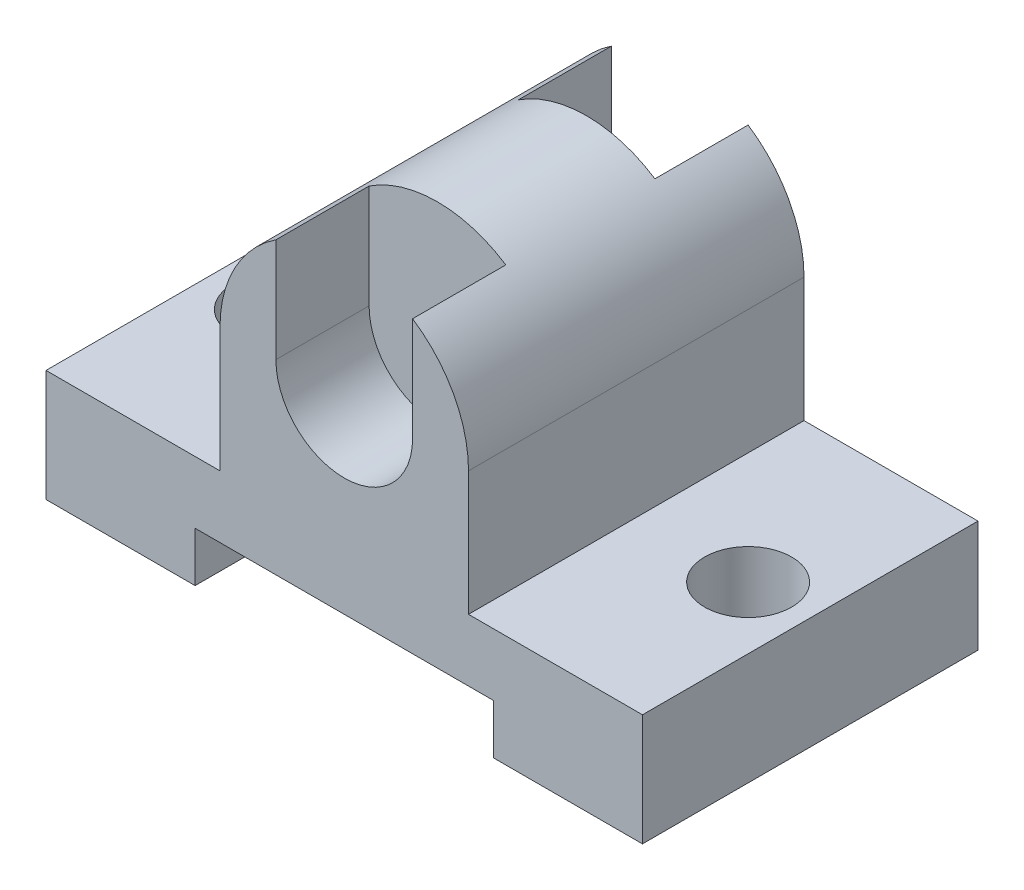
ISO-10303-21;
HEADER;
FILE_DESCRIPTION(('STEP AP214'),'2;1');
FILE_NAME('part.step','',(''),(''),'','','');
FILE_SCHEMA(('AUTOMOTIVE_DESIGN { 1 0 10303 214 1 1 1 1 }'));
ENDSEC;
DATA;
#1=APPLICATION_CONTEXT('core data for automotive mechanical design processes');
#2=APPLICATION_PROTOCOL_DEFINITION('international standard','automotive_design',2000,#1);
#3=PRODUCT_CONTEXT('',#1,'mechanical');
#4=PRODUCT('Part','Part','',(#3));
#5=PRODUCT_RELATED_PRODUCT_CATEGORY('part','',(#4));
#6=PRODUCT_DEFINITION_FORMATION('','',#4);
#7=PRODUCT_DEFINITION_CONTEXT('part definition',#1,'design');
#8=PRODUCT_DEFINITION('design','',#6,#7);
#9=PRODUCT_DEFINITION_SHAPE('','',#8);
#10=(LENGTH_UNIT() NAMED_UNIT(*) SI_UNIT(.MILLI.,.METRE.));
#11=(NAMED_UNIT(*) PLANE_ANGLE_UNIT() SI_UNIT($,.RADIAN.));
#12=(NAMED_UNIT(*) SI_UNIT($,.STERADIAN.) SOLID_ANGLE_UNIT());
#13=UNCERTAINTY_MEASURE_WITH_UNIT(LENGTH_MEASURE(1.E-05),#10,'distance_accuracy_value','');
#14=(GEOMETRIC_REPRESENTATION_CONTEXT(3) GLOBAL_UNCERTAINTY_ASSIGNED_CONTEXT((#13)) GLOBAL_UNIT_ASSIGNED_CONTEXT((#10,
#11,#12)) REPRESENTATION_CONTEXT('',''));
#15=CARTESIAN_POINT('',(0.,0.,0.));
#16=DIRECTION('',(0.,0.,1.));
#17=DIRECTION('',(1.,0.,0.));
#18=AXIS2_PLACEMENT_3D('',#15,#16,#17);
#19=CARTESIAN_POINT('',(-48.791461112919,0.,-54.));
#20=DIRECTION('',(-1.,0.,0.));
#21=DIRECTION('',(0.,0.,1.));
#22=AXIS2_PLACEMENT_3D('',#19,#20,#21);
#23=PLANE('',#22);
#24=DIRECTION('',(0.,-1.,0.));
#25=VECTOR('',#24,1.);
#26=CARTESIAN_POINT('',(-48.791461112919,0.,0.));
#27=LINE('',#26,#25);
#28=CARTESIAN_POINT('',(-48.791461112919,18.,0.));
#29=VERTEX_POINT('',#28);
#30=CARTESIAN_POINT('',(-48.791461112919,0.,0.));
#31=VERTEX_POINT('',#30);
#32=EDGE_CURVE('E275',#29,#31,#27,.T.);
#33=ORIENTED_EDGE('',*,*,#32,.F.);
#34=DIRECTION('',(0.,0.,1.));
#35=VECTOR('',#34,1.);
#36=CARTESIAN_POINT('',(-48.791461112919,18.,-54.));
#37=LINE('',#36,#35);
#38=CARTESIAN_POINT('',(-48.791461112919,18.,-54.));
#39=VERTEX_POINT('',#38);
#40=EDGE_CURVE('E312',#39,#29,#37,.T.);
#41=ORIENTED_EDGE('',*,*,#40,.F.);
#42=DIRECTION('',(0.,-1.,0.));
#43=VECTOR('',#42,1.);
#44=CARTESIAN_POINT('',(-48.791461112919,0.,-54.));
#45=LINE('',#44,#43);
#46=CARTESIAN_POINT('',(-48.791461112919,0.,-54.));
#47=VERTEX_POINT('',#46);
#48=EDGE_CURVE('E236',#39,#47,#45,.T.);
#49=ORIENTED_EDGE('',*,*,#48,.T.);
#50=DIRECTION('',(0.,0.,1.));
#51=VECTOR('',#50,1.);
#52=CARTESIAN_POINT('',(-48.791461112919,0.,-54.));
#53=LINE('',#52,#51);
#54=EDGE_CURVE('E274',#47,#31,#53,.T.);
#55=ORIENTED_EDGE('',*,*,#54,.T.);
#56=EDGE_LOOP('',(#33,#41,#49,#55));
#57=FACE_BOUND('',#56,.T.);
#58=ADVANCED_FACE('F37',(#57),#23,.T.);
#59=CARTESIAN_POINT('',(-48.791461112919,18.,-54.));
#60=DIRECTION('',(0.,1.,0.));
#61=DIRECTION('',(-1.,0.,0.));
#62=AXIS2_PLACEMENT_3D('',#59,#60,#61);
#63=PLANE('',#62);
#64=CARTESIAN_POINT('',(-38.791461112919,18.,-27.));
#65=DIRECTION('',(0.,1.,0.));
#66=DIRECTION('',(-1.,0.,0.));
#67=AXIS2_PLACEMENT_3D('',#64,#65,#66);
#68=CIRCLE('',#67,7.);
#69=CARTESIAN_POINT('',(-45.791461112919,18.,-27.));
#70=VERTEX_POINT('',#69);
#71=EDGE_CURVE('E223',#70,#70,#68,.T.);
#72=ORIENTED_EDGE('',*,*,#71,.F.);
#73=EDGE_LOOP('',(#72));
#74=FACE_BOUND('',#73,.T.);
#75=DIRECTION('',(-1.,0.,0.));
#76=VECTOR('',#75,1.);
#77=CARTESIAN_POINT('',(-48.791461112919,18.,0.));
#78=LINE('',#77,#76);
#79=CARTESIAN_POINT('',(-20.791461112919,18.,0.));
#80=VERTEX_POINT('',#79);
#81=EDGE_CURVE('E240',#80,#29,#78,.T.);
#82=ORIENTED_EDGE('',*,*,#81,.F.);
#83=DIRECTION('',(0.,0.,1.));
#84=VECTOR('',#83,1.);
#85=CARTESIAN_POINT('',(-20.791461112919,18.,-54.));
#86=LINE('',#85,#84);
#87=CARTESIAN_POINT('',(-20.791461112919,18.,-54.));
#88=VERTEX_POINT('',#87);
#89=EDGE_CURVE('E314',#88,#80,#86,.T.);
#90=ORIENTED_EDGE('',*,*,#89,.F.);
#91=DIRECTION('',(-1.,0.,0.));
#92=VECTOR('',#91,1.);
#93=CARTESIAN_POINT('',(-48.791461112919,18.,-54.));
#94=LINE('',#93,#92);
#95=EDGE_CURVE('E271',#88,#39,#94,.T.);
#96=ORIENTED_EDGE('',*,*,#95,.T.);
#97=ORIENTED_EDGE('',*,*,#40,.T.);
#98=EDGE_LOOP('',(#82,#90,#96,#97));
#99=FACE_BOUND('',#98,.T.);
#100=ADVANCED_FACE('F382',(#74,#99),#63,.T.);
#101=CARTESIAN_POINT('',(-20.791461112919,18.,-54.));
#102=DIRECTION('',(-1.,0.,0.));
#103=DIRECTION('',(0.,0.,1.));
#104=AXIS2_PLACEMENT_3D('',#101,#102,#103);
#105=PLANE('',#104);
#106=DIRECTION('',(0.,-1.,0.));
#107=VECTOR('',#106,1.);
#108=CARTESIAN_POINT('',(-20.791461112919,18.,0.));
#109=LINE('',#108,#107);
#110=CARTESIAN_POINT('',(-20.791461112919,38.,0.));
#111=VERTEX_POINT('',#110);
#112=EDGE_CURVE('E307',#111,#80,#109,.T.);
#113=ORIENTED_EDGE('',*,*,#112,.F.);
#114=DIRECTION('',(0.,0.,1.));
#115=VECTOR('',#114,1.);
#116=CARTESIAN_POINT('',(-20.791461112919,38.,-54.));
#117=LINE('',#116,#115);
#118=CARTESIAN_POINT('',(-20.791461112919,38.,-54.));
#119=VERTEX_POINT('',#118);
#120=EDGE_CURVE('E316',#119,#111,#117,.T.);
#121=ORIENTED_EDGE('',*,*,#120,.F.);
#122=DIRECTION('',(0.,-1.,0.));
#123=VECTOR('',#122,1.);
#124=CARTESIAN_POINT('',(-20.791461112919,18.,-54.));
#125=LINE('',#124,#123);
#126=EDGE_CURVE('E268',#119,#88,#125,.T.);
#127=ORIENTED_EDGE('',*,*,#126,.T.);
#128=ORIENTED_EDGE('',*,*,#89,.T.);
#129=EDGE_LOOP('',(#113,#121,#127,#128));
#130=FACE_BOUND('',#129,.T.);
#131=ADVANCED_FACE('F386',(#130),#105,.T.);
#132=CARTESIAN_POINT('',(-0.791461112918989,38.,-54.));
#133=DIRECTION('',(0.,0.,1.));
#134=DIRECTION('',(1.,0.,0.));
#135=AXIS2_PLACEMENT_3D('',#132,#133,#134);
#136=CYLINDRICAL_SURFACE('',#135,20.);
#137=DIRECTION('',(0.,0.,1.));
#138=VECTOR('',#137,1.);
#139=CARTESIAN_POINT('',(-11.791461112919,54.7032930884901,-54.));
#140=LINE('',#139,#138);
#141=CARTESIAN_POINT('',(-11.791461112919,54.7032930884901,-54.));
#142=VERTEX_POINT('',#141);
#143=CARTESIAN_POINT('',(-11.791461112919,54.7032930884901,-39.));
#144=VERTEX_POINT('',#143);
#145=EDGE_CURVE('E200',#142,#144,#140,.T.);
#146=ORIENTED_EDGE('',*,*,#145,.F.);
#147=CARTESIAN_POINT('',(-0.791461112918989,38.,-54.));
#148=DIRECTION('',(0.,0.,1.));
#149=DIRECTION('',(-1.,0.,0.));
#150=AXIS2_PLACEMENT_3D('',#147,#148,#149);
#151=CIRCLE('',#150,20.);
#152=EDGE_CURVE('E264',#142,#119,#151,.T.);
#153=ORIENTED_EDGE('',*,*,#152,.T.);
#154=ORIENTED_EDGE('',*,*,#120,.T.);
#155=CARTESIAN_POINT('',(-0.791461112918989,38.,0.));
#156=DIRECTION('',(0.,0.,1.));
#157=DIRECTION('',(-1.,0.,0.));
#158=AXIS2_PLACEMENT_3D('',#155,#156,#157);
#159=CIRCLE('',#158,20.);
#160=CARTESIAN_POINT('',(-11.791461112919,54.7032930884901,0.));
#161=VERTEX_POINT('',#160);
#162=EDGE_CURVE('E303',#161,#111,#159,.T.);
#163=ORIENTED_EDGE('',*,*,#162,.F.);
#164=DIRECTION('',(0.,0.,1.));
#165=VECTOR('',#164,1.);
#166=CARTESIAN_POINT('',(-11.791461112919,54.7032930884901,-15.));
#167=LINE('',#166,#165);
#168=CARTESIAN_POINT('',(-11.791461112919,54.7032930884901,-15.));
#169=VERTEX_POINT('',#168);
#170=EDGE_CURVE('E221',#169,#161,#167,.T.);
#171=ORIENTED_EDGE('',*,*,#170,.F.);
#172=CARTESIAN_POINT('',(-0.791461112918989,38.,-15.));
#173=DIRECTION('',(0.,0.,1.));
#174=DIRECTION('',(1.,0.,0.));
#175=AXIS2_PLACEMENT_3D('',#172,#173,#174);
#176=CIRCLE('',#175,20.);
#177=CARTESIAN_POINT('',(10.208538887081,54.7032930884901,-15.));
#178=VERTEX_POINT('',#177);
#179=EDGE_CURVE('E211',#178,#169,#176,.T.);
#180=ORIENTED_EDGE('',*,*,#179,.F.);
#181=DIRECTION('',(0.,0.,1.));
#182=VECTOR('',#181,1.);
#183=CARTESIAN_POINT('',(10.208538887081,54.7032930884901,-15.));
#184=LINE('',#183,#182);
#185=CARTESIAN_POINT('',(10.208538887081,54.7032930884901,0.));
#186=VERTEX_POINT('',#185);
#187=EDGE_CURVE('E224',#178,#186,#184,.T.);
#188=ORIENTED_EDGE('',*,*,#187,.T.);
#189=CARTESIAN_POINT('',(19.208538887081,38.,0.));
#190=VERTEX_POINT('',#189);
#191=EDGE_CURVE('E304',#190,#186,#159,.T.);
#192=ORIENTED_EDGE('',*,*,#191,.F.);
#193=DIRECTION('',(0.,0.,1.));
#194=VECTOR('',#193,1.);
#195=CARTESIAN_POINT('',(19.208538887081,38.,-54.));
#196=LINE('',#195,#194);
#197=CARTESIAN_POINT('',(19.208538887081,38.,-54.));
#198=VERTEX_POINT('',#197);
#199=EDGE_CURVE('E319',#198,#190,#196,.T.);
#200=ORIENTED_EDGE('',*,*,#199,.F.);
#201=CARTESIAN_POINT('',(10.208538887081,54.7032930884901,-54.));
#202=VERTEX_POINT('',#201);
#203=EDGE_CURVE('E265',#198,#202,#151,.T.);
#204=ORIENTED_EDGE('',*,*,#203,.T.);
#205=DIRECTION('',(0.,0.,1.));
#206=VECTOR('',#205,1.);
#207=CARTESIAN_POINT('',(10.208538887081,54.7032930884901,-54.));
#208=LINE('',#207,#206);
#209=CARTESIAN_POINT('',(10.208538887081,54.7032930884901,-39.));
#210=VERTEX_POINT('',#209);
#211=EDGE_CURVE('E51',#210,#202,#208,.F.);
#212=ORIENTED_EDGE('',*,*,#211,.F.);
#213=CARTESIAN_POINT('',(-0.791461112918989,38.,-39.));
#214=DIRECTION('',(0.,0.,-1.));
#215=DIRECTION('',(-1.,0.,0.));
#216=AXIS2_PLACEMENT_3D('',#213,#214,#215);
#217=CIRCLE('',#216,20.);
#218=EDGE_CURVE('E11',#210,#144,#217,.F.);
#219=ORIENTED_EDGE('',*,*,#218,.T.);
#220=EDGE_LOOP('',(#146,#153,#154,#163,#171,#180,#188,#192,#200,#204,#212,#219));
#221=FACE_BOUND('',#220,.T.);
#222=ADVANCED_FACE('F390',(#221),#136,.T.);
#223=CARTESIAN_POINT('',(19.208538887081,18.,-54.));
#224=DIRECTION('',(1.,0.,0.));
#225=DIRECTION('',(0.,0.,-1.));
#226=AXIS2_PLACEMENT_3D('',#223,#224,#225);
#227=PLANE('',#226);
#228=DIRECTION('',(0.,1.,0.));
#229=VECTOR('',#228,1.);
#230=CARTESIAN_POINT('',(19.208538887081,18.,0.));
#231=LINE('',#230,#229);
#232=CARTESIAN_POINT('',(19.208538887081,18.,0.));
#233=VERTEX_POINT('',#232);
#234=EDGE_CURVE('E300',#233,#190,#231,.T.);
#235=ORIENTED_EDGE('',*,*,#234,.F.);
#236=DIRECTION('',(0.,0.,1.));
#237=VECTOR('',#236,1.);
#238=CARTESIAN_POINT('',(19.208538887081,18.,-54.));
#239=LINE('',#238,#237);
#240=CARTESIAN_POINT('',(19.208538887081,18.,-54.));
#241=VERTEX_POINT('',#240);
#242=EDGE_CURVE('E321',#241,#233,#239,.T.);
#243=ORIENTED_EDGE('',*,*,#242,.F.);
#244=DIRECTION('',(0.,1.,0.));
#245=VECTOR('',#244,1.);
#246=CARTESIAN_POINT('',(19.208538887081,18.,-54.));
#247=LINE('',#246,#245);
#248=EDGE_CURVE('E261',#241,#198,#247,.T.);
#249=ORIENTED_EDGE('',*,*,#248,.T.);
#250=ORIENTED_EDGE('',*,*,#199,.T.);
#251=EDGE_LOOP('',(#235,#243,#249,#250));
#252=FACE_BOUND('',#251,.T.);
#253=ADVANCED_FACE('F399',(#252),#227,.T.);
#254=CARTESIAN_POINT('',(47.208538887081,18.,-54.));
#255=DIRECTION('',(0.,1.,0.));
#256=DIRECTION('',(-1.,0.,0.));
#257=AXIS2_PLACEMENT_3D('',#254,#255,#256);
#258=PLANE('',#257);
#259=CARTESIAN_POINT('',(37.208538887081,18.,-27.));
#260=DIRECTION('',(0.,1.,0.));
#261=DIRECTION('',(-1.,0.,0.));
#262=AXIS2_PLACEMENT_3D('',#259,#260,#261);
#263=CIRCLE('',#262,7.);
#264=CARTESIAN_POINT('',(30.208538887081,18.,-27.));
#265=VERTEX_POINT('',#264);
#266=EDGE_CURVE('E230',#265,#265,#263,.T.);
#267=ORIENTED_EDGE('',*,*,#266,.F.);
#268=EDGE_LOOP('',(#267));
#269=FACE_BOUND('',#268,.T.);
#270=DIRECTION('',(-1.,0.,0.));
#271=VECTOR('',#270,1.);
#272=CARTESIAN_POINT('',(47.208538887081,18.,0.));
#273=LINE('',#272,#271);
#274=CARTESIAN_POINT('',(47.208538887081,18.,0.));
#275=VERTEX_POINT('',#274);
#276=EDGE_CURVE('E297',#275,#233,#273,.T.);
#277=ORIENTED_EDGE('',*,*,#276,.F.);
#278=DIRECTION('',(0.,0.,1.));
#279=VECTOR('',#278,1.);
#280=CARTESIAN_POINT('',(47.208538887081,18.,-54.));
#281=LINE('',#280,#279);
#282=CARTESIAN_POINT('',(47.208538887081,18.,-54.));
#283=VERTEX_POINT('',#282);
#284=EDGE_CURVE('E323',#283,#275,#281,.T.);
#285=ORIENTED_EDGE('',*,*,#284,.F.);
#286=DIRECTION('',(-1.,0.,0.));
#287=VECTOR('',#286,1.);
#288=CARTESIAN_POINT('',(47.208538887081,18.,-54.));
#289=LINE('',#288,#287);
#290=EDGE_CURVE('E258',#283,#241,#289,.T.);
#291=ORIENTED_EDGE('',*,*,#290,.T.);
#292=ORIENTED_EDGE('',*,*,#242,.T.);
#293=EDGE_LOOP('',(#277,#285,#291,#292));
#294=FACE_BOUND('',#293,.T.);
#295=ADVANCED_FACE('F403',(#269,#294),#258,.T.);
#296=CARTESIAN_POINT('',(47.208538887081,0.,-54.));
#297=DIRECTION('',(1.,0.,0.));
#298=DIRECTION('',(0.,0.,-1.));
#299=AXIS2_PLACEMENT_3D('',#296,#297,#298);
#300=PLANE('',#299);
#301=DIRECTION('',(0.,1.,0.));
#302=VECTOR('',#301,1.);
#303=CARTESIAN_POINT('',(47.208538887081,0.,0.));
#304=LINE('',#303,#302);
#305=CARTESIAN_POINT('',(47.208538887081,0.,0.));
#306=VERTEX_POINT('',#305);
#307=EDGE_CURVE('E294',#306,#275,#304,.T.);
#308=ORIENTED_EDGE('',*,*,#307,.F.);
#309=DIRECTION('',(0.,0.,1.));
#310=VECTOR('',#309,1.);
#311=CARTESIAN_POINT('',(47.208538887081,0.,-54.));
#312=LINE('',#311,#310);
#313=CARTESIAN_POINT('',(47.208538887081,0.,-54.));
#314=VERTEX_POINT('',#313);
#315=EDGE_CURVE('E325',#314,#306,#312,.T.);
#316=ORIENTED_EDGE('',*,*,#315,.F.);
#317=DIRECTION('',(0.,1.,0.));
#318=VECTOR('',#317,1.);
#319=CARTESIAN_POINT('',(47.208538887081,0.,-54.));
#320=LINE('',#319,#318);
#321=EDGE_CURVE('E255',#314,#283,#320,.T.);
#322=ORIENTED_EDGE('',*,*,#321,.T.);
#323=ORIENTED_EDGE('',*,*,#284,.T.);
#324=EDGE_LOOP('',(#308,#316,#322,#323));
#325=FACE_BOUND('',#324,.T.);
#326=ADVANCED_FACE('F348',(#325),#300,.T.);
#327=CARTESIAN_POINT('',(23.208538887081,0.,-54.));
#328=DIRECTION('',(0.,-1.,0.));
#329=DIRECTION('',(0.,0.,-1.));
#330=AXIS2_PLACEMENT_3D('',#327,#328,#329);
#331=PLANE('',#330);
#332=CARTESIAN_POINT('',(37.208538887081,0.,-27.));
#333=DIRECTION('',(0.,-1.,0.));
#334=DIRECTION('',(0.,0.,-1.));
#335=AXIS2_PLACEMENT_3D('',#332,#333,#334);
#336=CIRCLE('',#335,7.);
#337=CARTESIAN_POINT('',(37.208538887081,0.,-34.));
#338=VERTEX_POINT('',#337);
#339=EDGE_CURVE('E279',#338,#338,#336,.T.);
#340=ORIENTED_EDGE('',*,*,#339,.F.);
#341=EDGE_LOOP('',(#340));
#342=FACE_BOUND('',#341,.T.);
#343=DIRECTION('',(1.,0.,0.));
#344=VECTOR('',#343,1.);
#345=CARTESIAN_POINT('',(23.208538887081,0.,0.));
#346=LINE('',#345,#344);
#347=CARTESIAN_POINT('',(23.208538887081,0.,0.));
#348=VERTEX_POINT('',#347);
#349=EDGE_CURVE('E291',#348,#306,#346,.T.);
#350=ORIENTED_EDGE('',*,*,#349,.F.);
#351=DIRECTION('',(0.,0.,1.));
#352=VECTOR('',#351,1.);
#353=CARTESIAN_POINT('',(23.208538887081,0.,-54.));
#354=LINE('',#353,#352);
#355=CARTESIAN_POINT('',(23.208538887081,0.,-54.));
#356=VERTEX_POINT('',#355);
#357=EDGE_CURVE('E327',#356,#348,#354,.T.);
#358=ORIENTED_EDGE('',*,*,#357,.F.);
#359=DIRECTION('',(1.,0.,0.));
#360=VECTOR('',#359,1.);
#361=CARTESIAN_POINT('',(23.208538887081,0.,-54.));
#362=LINE('',#361,#360);
#363=EDGE_CURVE('E252',#356,#314,#362,.T.);
#364=ORIENTED_EDGE('',*,*,#363,.T.);
#365=ORIENTED_EDGE('',*,*,#315,.T.);
#366=EDGE_LOOP('',(#350,#358,#364,#365));
#367=FACE_BOUND('',#366,.T.);
#368=ADVANCED_FACE('F344',(#342,#367),#331,.T.);
#369=CARTESIAN_POINT('',(23.208538887081,8.,-54.));
#370=DIRECTION('',(-1.,0.,0.));
#371=DIRECTION('',(0.,0.,1.));
#372=AXIS2_PLACEMENT_3D('',#369,#370,#371);
#373=PLANE('',#372);
#374=DIRECTION('',(0.,-1.,0.));
#375=VECTOR('',#374,1.);
#376=CARTESIAN_POINT('',(23.208538887081,8.,0.));
#377=LINE('',#376,#375);
#378=CARTESIAN_POINT('',(23.208538887081,8.,0.));
#379=VERTEX_POINT('',#378);
#380=EDGE_CURVE('E288',#379,#348,#377,.T.);
#381=ORIENTED_EDGE('',*,*,#380,.F.);
#382=DIRECTION('',(0.,0.,1.));
#383=VECTOR('',#382,1.);
#384=CARTESIAN_POINT('',(23.208538887081,8.,-54.));
#385=LINE('',#384,#383);
#386=CARTESIAN_POINT('',(23.208538887081,8.,-54.));
#387=VERTEX_POINT('',#386);
#388=EDGE_CURVE('E329',#387,#379,#385,.T.);
#389=ORIENTED_EDGE('',*,*,#388,.F.);
#390=DIRECTION('',(0.,-1.,0.));
#391=VECTOR('',#390,1.);
#392=CARTESIAN_POINT('',(23.208538887081,8.,-54.));
#393=LINE('',#392,#391);
#394=EDGE_CURVE('E249',#387,#356,#393,.T.);
#395=ORIENTED_EDGE('',*,*,#394,.T.);
#396=ORIENTED_EDGE('',*,*,#357,.T.);
#397=EDGE_LOOP('',(#381,#389,#395,#396));
#398=FACE_BOUND('',#397,.T.);
#399=ADVANCED_FACE('F347',(#398),#373,.T.);
#400=CARTESIAN_POINT('',(-24.791461112919,8.,-54.));
#401=DIRECTION('',(0.,-1.,0.));
#402=DIRECTION('',(0.,0.,-1.));
#403=AXIS2_PLACEMENT_3D('',#400,#401,#402);
#404=PLANE('',#403);
#405=DIRECTION('',(1.,0.,0.));
#406=VECTOR('',#405,1.);
#407=CARTESIAN_POINT('',(-24.791461112919,8.,0.));
#408=LINE('',#407,#406);
#409=CARTESIAN_POINT('',(-24.791461112919,8.,0.));
#410=VERTEX_POINT('',#409);
#411=EDGE_CURVE('E285',#410,#379,#408,.T.);
#412=ORIENTED_EDGE('',*,*,#411,.F.);
#413=DIRECTION('',(0.,0.,1.));
#414=VECTOR('',#413,1.);
#415=CARTESIAN_POINT('',(-24.791461112919,8.,-54.));
#416=LINE('',#415,#414);
#417=CARTESIAN_POINT('',(-24.791461112919,8.,-54.));
#418=VERTEX_POINT('',#417);
#419=EDGE_CURVE('E331',#418,#410,#416,.T.);
#420=ORIENTED_EDGE('',*,*,#419,.F.);
#421=DIRECTION('',(1.,0.,0.));
#422=VECTOR('',#421,1.);
#423=CARTESIAN_POINT('',(-24.791461112919,8.,-54.));
#424=LINE('',#423,#422);
#425=EDGE_CURVE('E246',#418,#387,#424,.T.);
#426=ORIENTED_EDGE('',*,*,#425,.T.);
#427=ORIENTED_EDGE('',*,*,#388,.T.);
#428=EDGE_LOOP('',(#412,#420,#426,#427));
#429=FACE_BOUND('',#428,.T.);
#430=ADVANCED_FACE('F367',(#429),#404,.T.);
#431=CARTESIAN_POINT('',(-24.791461112919,0.,-54.));
#432=DIRECTION('',(1.,0.,0.));
#433=DIRECTION('',(0.,0.,-1.));
#434=AXIS2_PLACEMENT_3D('',#431,#432,#433);
#435=PLANE('',#434);
#436=DIRECTION('',(0.,1.,0.));
#437=VECTOR('',#436,1.);
#438=CARTESIAN_POINT('',(-24.791461112919,0.,0.));
#439=LINE('',#438,#437);
#440=CARTESIAN_POINT('',(-24.791461112919,0.,0.));
#441=VERTEX_POINT('',#440);
#442=EDGE_CURVE('E282',#441,#410,#439,.T.);
#443=ORIENTED_EDGE('',*,*,#442,.F.);
#444=DIRECTION('',(0.,0.,1.));
#445=VECTOR('',#444,1.);
#446=CARTESIAN_POINT('',(-24.791461112919,0.,-54.));
#447=LINE('',#446,#445);
#448=CARTESIAN_POINT('',(-24.791461112919,0.,-54.));
#449=VERTEX_POINT('',#448);
#450=EDGE_CURVE('E333',#449,#441,#447,.T.);
#451=ORIENTED_EDGE('',*,*,#450,.F.);
#452=DIRECTION('',(0.,1.,0.));
#453=VECTOR('',#452,1.);
#454=CARTESIAN_POINT('',(-24.791461112919,0.,-54.));
#455=LINE('',#454,#453);
#456=EDGE_CURVE('E243',#449,#418,#455,.T.);
#457=ORIENTED_EDGE('',*,*,#456,.T.);
#458=ORIENTED_EDGE('',*,*,#419,.T.);
#459=EDGE_LOOP('',(#443,#451,#457,#458));
#460=FACE_BOUND('',#459,.T.);
#461=ADVANCED_FACE('F370',(#460),#435,.T.);
#462=CARTESIAN_POINT('',(-48.791461112919,0.,-54.));
#463=DIRECTION('',(0.,-1.,0.));
#464=DIRECTION('',(1.,0.,0.));
#465=AXIS2_PLACEMENT_3D('',#462,#463,#464);
#466=PLANE('',#465);
#467=CARTESIAN_POINT('',(-38.791461112919,0.,-27.));
#468=DIRECTION('',(0.,-1.,0.));
#469=DIRECTION('',(1.,0.,0.));
#470=AXIS2_PLACEMENT_3D('',#467,#468,#469);
#471=CIRCLE('',#470,7.);
#472=CARTESIAN_POINT('',(-31.791461112919,0.,-27.));
#473=VERTEX_POINT('',#472);
#474=EDGE_CURVE('E233',#473,#473,#471,.T.);
#475=ORIENTED_EDGE('',*,*,#474,.F.);
#476=EDGE_LOOP('',(#475));
#477=FACE_BOUND('',#476,.T.);
#478=DIRECTION('',(1.,0.,0.));
#479=VECTOR('',#478,1.);
#480=CARTESIAN_POINT('',(-48.791461112919,0.,0.));
#481=LINE('',#480,#479);
#482=EDGE_CURVE('E278',#31,#441,#481,.T.);
#483=ORIENTED_EDGE('',*,*,#482,.F.);
#484=ORIENTED_EDGE('',*,*,#54,.F.);
#485=DIRECTION('',(1.,0.,0.));
#486=VECTOR('',#485,1.);
#487=CARTESIAN_POINT('',(-48.791461112919,0.,-54.));
#488=LINE('',#487,#486);
#489=EDGE_CURVE('E239',#47,#449,#488,.T.);
#490=ORIENTED_EDGE('',*,*,#489,.T.);
#491=ORIENTED_EDGE('',*,*,#450,.T.);
#492=EDGE_LOOP('',(#483,#484,#490,#491));
#493=FACE_BOUND('',#492,.T.);
#494=ADVANCED_FACE('F375',(#477,#493),#466,.T.);
#495=CARTESIAN_POINT('',(-0.791461112918989,38.,-54.));
#496=DIRECTION('',(0.,0.,-1.));
#497=DIRECTION('',(-1.,0.,0.));
#498=AXIS2_PLACEMENT_3D('',#495,#496,#497);
#499=PLANE('',#498);
#500=DIRECTION('',(0.,1.,0.));
#501=VECTOR('',#500,1.);
#502=CARTESIAN_POINT('',(-11.791461112919,58.,-54.));
#503=LINE('',#502,#501);
#504=CARTESIAN_POINT('',(-11.791461112919,38.,-54.));
#505=VERTEX_POINT('',#504);
#506=EDGE_CURVE('E180',#505,#142,#503,.T.);
#507=ORIENTED_EDGE('',*,*,#506,.F.);
#508=CARTESIAN_POINT('',(-0.791461112918989,38.,-54.));
#509=DIRECTION('',(0.,0.,-1.));
#510=DIRECTION('',(-1.,0.,0.));
#511=AXIS2_PLACEMENT_3D('',#508,#509,#510);
#512=CIRCLE('',#511,11.);
#513=CARTESIAN_POINT('',(10.208538887081,38.,-54.));
#514=VERTEX_POINT('',#513);
#515=EDGE_CURVE('E195',#514,#505,#512,.T.);
#516=ORIENTED_EDGE('',*,*,#515,.F.);
#517=DIRECTION('',(0.,-1.,0.));
#518=VECTOR('',#517,1.);
#519=CARTESIAN_POINT('',(10.208538887081,38.,-54.));
#520=LINE('',#519,#518);
#521=EDGE_CURVE('E44',#202,#514,#520,.T.);
#522=ORIENTED_EDGE('',*,*,#521,.F.);
#523=ORIENTED_EDGE('',*,*,#203,.F.);
#524=ORIENTED_EDGE('',*,*,#248,.F.);
#525=ORIENTED_EDGE('',*,*,#290,.F.);
#526=ORIENTED_EDGE('',*,*,#321,.F.);
#527=ORIENTED_EDGE('',*,*,#363,.F.);
#528=ORIENTED_EDGE('',*,*,#394,.F.);
#529=ORIENTED_EDGE('',*,*,#425,.F.);
#530=ORIENTED_EDGE('',*,*,#456,.F.);
#531=ORIENTED_EDGE('',*,*,#489,.F.);
#532=ORIENTED_EDGE('',*,*,#48,.F.);
#533=ORIENTED_EDGE('',*,*,#95,.F.);
#534=ORIENTED_EDGE('',*,*,#126,.F.);
#535=ORIENTED_EDGE('',*,*,#152,.F.);
#536=EDGE_LOOP('',(#507,#516,#522,#523,#524,#525,#526,#527,#528,#529,#530,#531,#532,#533,#534,#535));
#537=FACE_BOUND('',#536,.T.);
#538=ADVANCED_FACE('F363',(#537),#499,.T.);
#539=CARTESIAN_POINT('',(-0.791461112918989,38.,0.));
#540=DIRECTION('',(0.,0.,-1.));
#541=DIRECTION('',(-1.,0.,0.));
#542=AXIS2_PLACEMENT_3D('',#539,#540,#541);
#543=PLANE('',#542);
#544=CARTESIAN_POINT('',(-0.791461112918989,38.,0.));
#545=DIRECTION('',(0.,0.,1.));
#546=DIRECTION('',(1.,0.,0.));
#547=AXIS2_PLACEMENT_3D('',#544,#545,#546);
#548=CIRCLE('',#547,11.);
#549=CARTESIAN_POINT('',(-11.791461112919,38.,0.));
#550=VERTEX_POINT('',#549);
#551=CARTESIAN_POINT('',(10.208538887081,38.,0.));
#552=VERTEX_POINT('',#551);
#553=EDGE_CURVE('E216',#550,#552,#548,.T.);
#554=ORIENTED_EDGE('',*,*,#553,.F.);
#555=DIRECTION('',(0.,-1.,0.));
#556=VECTOR('',#555,1.);
#557=CARTESIAN_POINT('',(-11.791461112919,0.,0.));
#558=LINE('',#557,#556);
#559=EDGE_CURVE('E59',#161,#550,#558,.T.);
#560=ORIENTED_EDGE('',*,*,#559,.F.);
#561=ORIENTED_EDGE('',*,*,#162,.T.);
#562=ORIENTED_EDGE('',*,*,#112,.T.);
#563=ORIENTED_EDGE('',*,*,#81,.T.);
#564=ORIENTED_EDGE('',*,*,#32,.T.);
#565=ORIENTED_EDGE('',*,*,#482,.T.);
#566=ORIENTED_EDGE('',*,*,#442,.T.);
#567=ORIENTED_EDGE('',*,*,#411,.T.);
#568=ORIENTED_EDGE('',*,*,#380,.T.);
#569=ORIENTED_EDGE('',*,*,#349,.T.);
#570=ORIENTED_EDGE('',*,*,#307,.T.);
#571=ORIENTED_EDGE('',*,*,#276,.T.);
#572=ORIENTED_EDGE('',*,*,#234,.T.);
#573=ORIENTED_EDGE('',*,*,#191,.T.);
#574=DIRECTION('',(0.,-1.,0.));
#575=VECTOR('',#574,1.);
#576=CARTESIAN_POINT('',(10.208538887081,0.,0.));
#577=LINE('',#576,#575);
#578=EDGE_CURVE('E206',#186,#552,#577,.T.);
#579=ORIENTED_EDGE('',*,*,#578,.T.);
#580=EDGE_LOOP('',(#554,#560,#561,#562,#563,#564,#565,#566,#567,#568,#569,#570,#571,#572,#573,#579));
#581=FACE_BOUND('',#580,.T.);
#582=ADVANCED_FACE('F356',(#581),#543,.F.);
#583=CARTESIAN_POINT('',(-38.791461112919,-36.,-27.));
#584=DIRECTION('',(0.,1.,0.));
#585=DIRECTION('',(-1.,0.,0.));
#586=AXIS2_PLACEMENT_3D('',#583,#584,#585);
#587=CYLINDRICAL_SURFACE('',#586,7.);
#588=ORIENTED_EDGE('',*,*,#474,.T.);
#589=EDGE_LOOP('',(#588));
#590=FACE_BOUND('',#589,.T.);
#591=ORIENTED_EDGE('',*,*,#71,.T.);
#592=EDGE_LOOP('',(#591));
#593=FACE_BOUND('',#592,.T.);
#594=ADVANCED_FACE('F424',(#590,#593),#587,.F.);
#595=CARTESIAN_POINT('',(37.208538887081,-36.,-27.));
#596=DIRECTION('',(0.,1.,0.));
#597=DIRECTION('',(-1.,0.,0.));
#598=AXIS2_PLACEMENT_3D('',#595,#596,#597);
#599=CYLINDRICAL_SURFACE('',#598,7.);
#600=ORIENTED_EDGE('',*,*,#339,.T.);
#601=EDGE_LOOP('',(#600));
#602=FACE_BOUND('',#601,.T.);
#603=ORIENTED_EDGE('',*,*,#266,.T.);
#604=EDGE_LOOP('',(#603));
#605=FACE_BOUND('',#604,.T.);
#606=ADVANCED_FACE('F341',(#602,#605),#599,.F.);
#607=CARTESIAN_POINT('',(-11.791461112919,0.,-15.));
#608=DIRECTION('',(-1.,0.,0.));
#609=DIRECTION('',(0.,-1.,0.));
#610=AXIS2_PLACEMENT_3D('',#607,#608,#609);
#611=PLANE('',#610);
#612=ORIENTED_EDGE('',*,*,#559,.T.);
#613=DIRECTION('',(0.,0.,1.));
#614=VECTOR('',#613,1.);
#615=CARTESIAN_POINT('',(-11.791461112919,38.,-15.));
#616=LINE('',#615,#614);
#617=CARTESIAN_POINT('',(-11.791461112919,38.,-15.));
#618=VERTEX_POINT('',#617);
#619=EDGE_CURVE('E214',#618,#550,#616,.T.);
#620=ORIENTED_EDGE('',*,*,#619,.F.);
#621=DIRECTION('',(0.,-1.,0.));
#622=VECTOR('',#621,1.);
#623=CARTESIAN_POINT('',(-11.791461112919,0.,-15.));
#624=LINE('',#623,#622);
#625=EDGE_CURVE('E202',#169,#618,#624,.T.);
#626=ORIENTED_EDGE('',*,*,#625,.F.);
#627=ORIENTED_EDGE('',*,*,#170,.T.);
#628=EDGE_LOOP('',(#612,#620,#626,#627));
#629=FACE_BOUND('',#628,.T.);
#630=ADVANCED_FACE('F416',(#629),#611,.F.);
#631=CARTESIAN_POINT('',(10.208538887081,0.,-15.));
#632=DIRECTION('',(-1.,0.,0.));
#633=DIRECTION('',(0.,-1.,0.));
#634=AXIS2_PLACEMENT_3D('',#631,#632,#633);
#635=PLANE('',#634);
#636=ORIENTED_EDGE('',*,*,#578,.F.);
#637=ORIENTED_EDGE('',*,*,#187,.F.);
#638=DIRECTION('',(0.,-1.,0.));
#639=VECTOR('',#638,1.);
#640=CARTESIAN_POINT('',(10.208538887081,0.,-15.));
#641=LINE('',#640,#639);
#642=CARTESIAN_POINT('',(10.208538887081,38.,-15.));
#643=VERTEX_POINT('',#642);
#644=EDGE_CURVE('E209',#178,#643,#641,.T.);
#645=ORIENTED_EDGE('',*,*,#644,.T.);
#646=DIRECTION('',(0.,0.,1.));
#647=VECTOR('',#646,1.);
#648=CARTESIAN_POINT('',(10.208538887081,38.,-15.));
#649=LINE('',#648,#647);
#650=EDGE_CURVE('E227',#643,#552,#649,.T.);
#651=ORIENTED_EDGE('',*,*,#650,.T.);
#652=EDGE_LOOP('',(#636,#637,#645,#651));
#653=FACE_BOUND('',#652,.T.);
#654=ADVANCED_FACE('F406',(#653),#635,.T.);
#655=CARTESIAN_POINT('',(-0.791461112918989,38.,-15.));
#656=DIRECTION('',(0.,0.,1.));
#657=DIRECTION('',(1.,0.,0.));
#658=AXIS2_PLACEMENT_3D('',#655,#656,#657);
#659=CYLINDRICAL_SURFACE('',#658,11.);
#660=ORIENTED_EDGE('',*,*,#553,.T.);
#661=ORIENTED_EDGE('',*,*,#650,.F.);
#662=CARTESIAN_POINT('',(-0.791461112918989,38.,-15.));
#663=DIRECTION('',(0.,0.,1.));
#664=DIRECTION('',(1.,0.,0.));
#665=AXIS2_PLACEMENT_3D('',#662,#663,#664);
#666=CIRCLE('',#665,11.);
#667=EDGE_CURVE('E205',#618,#643,#666,.T.);
#668=ORIENTED_EDGE('',*,*,#667,.F.);
#669=ORIENTED_EDGE('',*,*,#619,.T.);
#670=EDGE_LOOP('',(#660,#661,#668,#669));
#671=FACE_BOUND('',#670,.T.);
#672=ADVANCED_FACE('F415',(#671),#659,.F.);
#673=CARTESIAN_POINT('',(0.,0.,-15.));
#674=DIRECTION('',(0.,0.,1.));
#675=DIRECTION('',(1.,0.,0.));
#676=AXIS2_PLACEMENT_3D('',#673,#674,#675);
#677=PLANE('',#676);
#678=ORIENTED_EDGE('',*,*,#625,.T.);
#679=ORIENTED_EDGE('',*,*,#667,.T.);
#680=ORIENTED_EDGE('',*,*,#644,.F.);
#681=ORIENTED_EDGE('',*,*,#179,.T.);
#682=EDGE_LOOP('',(#678,#679,#680,#681));
#683=FACE_BOUND('',#682,.T.);
#684=ADVANCED_FACE('F412',(#683),#677,.T.);
#685=CARTESIAN_POINT('',(-11.791461112919,58.,-39.));
#686=DIRECTION('',(-1.,0.,0.));
#687=DIRECTION('',(0.,-1.,0.));
#688=AXIS2_PLACEMENT_3D('',#685,#686,#687);
#689=PLANE('',#688);
#690=ORIENTED_EDGE('',*,*,#145,.T.);
#691=DIRECTION('',(0.,1.,0.));
#692=VECTOR('',#691,1.);
#693=CARTESIAN_POINT('',(-11.791461112919,58.,-39.));
#694=LINE('',#693,#692);
#695=CARTESIAN_POINT('',(-11.791461112919,38.,-39.));
#696=VERTEX_POINT('',#695);
#697=EDGE_CURVE('E189',#696,#144,#694,.T.);
#698=ORIENTED_EDGE('',*,*,#697,.F.);
#699=DIRECTION('',(0.,0.,-1.));
#700=VECTOR('',#699,1.);
#701=CARTESIAN_POINT('',(-11.791461112919,38.,-39.));
#702=LINE('',#701,#700);
#703=EDGE_CURVE('E188',#696,#505,#702,.T.);
#704=ORIENTED_EDGE('',*,*,#703,.T.);
#705=ORIENTED_EDGE('',*,*,#506,.T.);
#706=EDGE_LOOP('',(#690,#698,#704,#705));
#707=FACE_BOUND('',#706,.T.);
#708=ADVANCED_FACE('F393',(#707),#689,.F.);
#709=CARTESIAN_POINT('',(-0.791461112918989,38.,-39.));
#710=DIRECTION('',(0.,0.,-1.));
#711=DIRECTION('',(-1.,0.,0.));
#712=AXIS2_PLACEMENT_3D('',#709,#710,#711);
#713=CYLINDRICAL_SURFACE('',#712,11.);
#714=ORIENTED_EDGE('',*,*,#515,.T.);
#715=ORIENTED_EDGE('',*,*,#703,.F.);
#716=CARTESIAN_POINT('',(-0.791461112918989,38.,-39.));
#717=DIRECTION('',(0.,0.,-1.));
#718=DIRECTION('',(-1.,0.,0.));
#719=AXIS2_PLACEMENT_3D('',#716,#717,#718);
#720=CIRCLE('',#719,11.);
#721=CARTESIAN_POINT('',(10.208538887081,38.,-39.));
#722=VERTEX_POINT('',#721);
#723=EDGE_CURVE('E178',#722,#696,#720,.T.);
#724=ORIENTED_EDGE('',*,*,#723,.F.);
#725=DIRECTION('',(0.,0.,-1.));
#726=VECTOR('',#725,1.);
#727=CARTESIAN_POINT('',(10.208538887081,38.,-39.));
#728=LINE('',#727,#726);
#729=EDGE_CURVE('E183',#722,#514,#728,.T.);
#730=ORIENTED_EDGE('',*,*,#729,.T.);
#731=EDGE_LOOP('',(#714,#715,#724,#730));
#732=FACE_BOUND('',#731,.T.);
#733=ADVANCED_FACE('F191',(#732),#713,.F.);
#734=CARTESIAN_POINT('',(10.208538887081,58.,-39.));
#735=DIRECTION('',(1.,0.,0.));
#736=DIRECTION('',(0.,1.,0.));
#737=AXIS2_PLACEMENT_3D('',#734,#735,#736);
#738=PLANE('',#737);
#739=ORIENTED_EDGE('',*,*,#211,.T.);
#740=ORIENTED_EDGE('',*,*,#521,.T.);
#741=ORIENTED_EDGE('',*,*,#729,.F.);
#742=DIRECTION('',(0.,-1.,0.));
#743=VECTOR('',#742,1.);
#744=CARTESIAN_POINT('',(10.208538887081,58.,-39.));
#745=LINE('',#744,#743);
#746=EDGE_CURVE('E173',#210,#722,#745,.T.);
#747=ORIENTED_EDGE('',*,*,#746,.F.);
#748=EDGE_LOOP('',(#739,#740,#741,#747));
#749=FACE_BOUND('',#748,.T.);
#750=ADVANCED_FACE('F184',(#749),#738,.F.);
#751=CARTESIAN_POINT('',(-0.79146111291899,58.,-39.));
#752=DIRECTION('',(0.,0.,-1.));
#753=DIRECTION('',(-1.,0.,0.));
#754=AXIS2_PLACEMENT_3D('',#751,#752,#753);
#755=PLANE('',#754);
#756=ORIENTED_EDGE('',*,*,#746,.T.);
#757=ORIENTED_EDGE('',*,*,#723,.T.);
#758=ORIENTED_EDGE('',*,*,#697,.T.);
#759=ORIENTED_EDGE('',*,*,#218,.F.);
#760=EDGE_LOOP('',(#756,#757,#758,#759));
#761=FACE_BOUND('',#760,.T.);
#762=ADVANCED_FACE('F175',(#761),#755,.T.);
#763=CLOSED_SHELL('',(#58,#100,#131,#222,#253,#295,#326,#368,#399,#430,#461,#494,#538,#582,#594,
#606,#630,#654,#672,#684,#708,#733,#750,#762));
#764=MANIFOLD_SOLID_BREP('B2',#763);
#765=ADVANCED_BREP_SHAPE_REPRESENTATION('',(#18,#764),#14);
#766=SHAPE_DEFINITION_REPRESENTATION(#9,#765);
ENDSEC;
END-ISO-10303-21;
